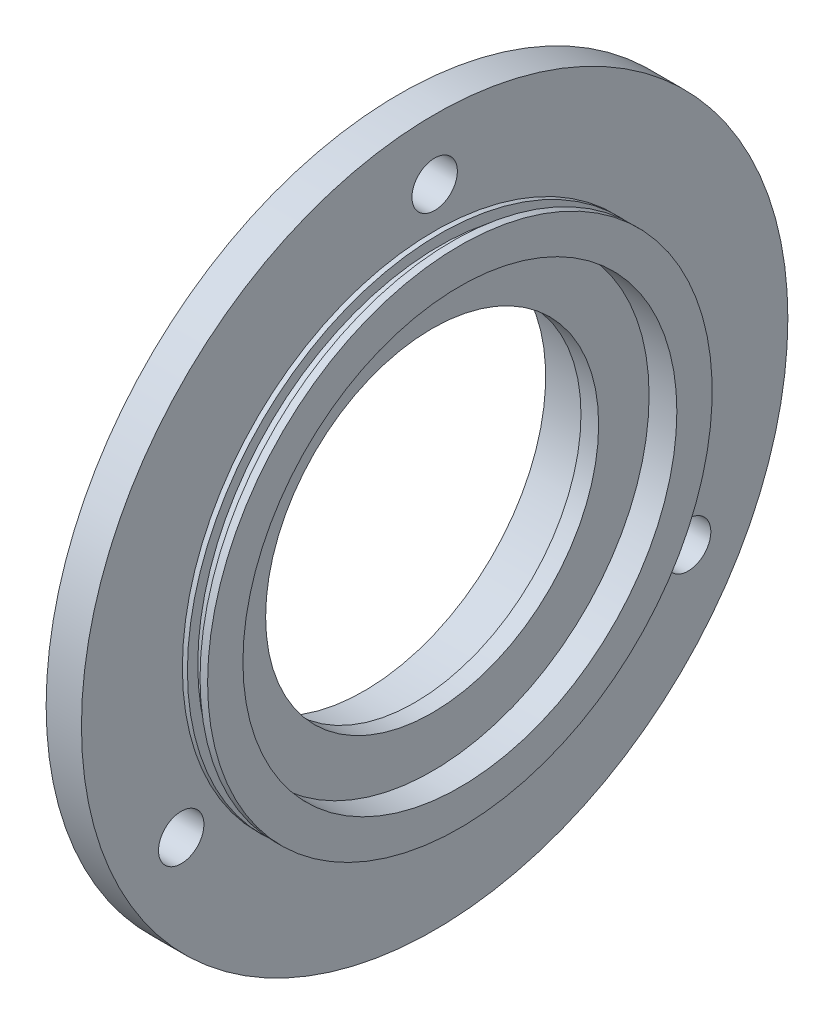
ISO-10303-21;
HEADER;
FILE_DESCRIPTION(('STEP AP214'),'2;1');
FILE_NAME('part.step','',(''),(''),'','','');
FILE_SCHEMA(('AUTOMOTIVE_DESIGN { 1 0 10303 214 1 1 1 1 }'));
ENDSEC;
DATA;
#1=APPLICATION_CONTEXT('core data for automotive mechanical design processes');
#2=APPLICATION_PROTOCOL_DEFINITION('international standard','automotive_design',2000,#1);
#3=PRODUCT_CONTEXT('',#1,'mechanical');
#4=PRODUCT('Part','Part','',(#3));
#5=PRODUCT_RELATED_PRODUCT_CATEGORY('part','',(#4));
#6=PRODUCT_DEFINITION_FORMATION('','',#4);
#7=PRODUCT_DEFINITION_CONTEXT('part definition',#1,'design');
#8=PRODUCT_DEFINITION('design','',#6,#7);
#9=PRODUCT_DEFINITION_SHAPE('','',#8);
#10=(LENGTH_UNIT() NAMED_UNIT(*) SI_UNIT(.MILLI.,.METRE.));
#11=(NAMED_UNIT(*) PLANE_ANGLE_UNIT() SI_UNIT($,.RADIAN.));
#12=(NAMED_UNIT(*) SI_UNIT($,.STERADIAN.) SOLID_ANGLE_UNIT());
#13=UNCERTAINTY_MEASURE_WITH_UNIT(LENGTH_MEASURE(1.E-05),#10,'distance_accuracy_value','');
#14=(GEOMETRIC_REPRESENTATION_CONTEXT(3) GLOBAL_UNCERTAINTY_ASSIGNED_CONTEXT((#13)) GLOBAL_UNIT_ASSIGNED_CONTEXT((#10,
#11,#12)) REPRESENTATION_CONTEXT('',''));
#15=CARTESIAN_POINT('',(0.,0.,0.));
#16=DIRECTION('',(0.,0.,1.));
#17=DIRECTION('',(1.,0.,0.));
#18=AXIS2_PLACEMENT_3D('',#15,#16,#17);
#19=CARTESIAN_POINT('',(-54.5549392406658,0.,0.));
#20=DIRECTION('',(-1.,0.,0.));
#21=DIRECTION('',(0.,0.,1.));
#22=AXIS2_PLACEMENT_3D('',#19,#20,#21);
#23=CYLINDRICAL_SURFACE('',#22,43.);
#24=CARTESIAN_POINT('',(0.,0.,0.));
#25=DIRECTION('',(-1.,0.,0.));
#26=DIRECTION('',(0.,0.,1.));
#27=AXIS2_PLACEMENT_3D('',#24,#25,#26);
#28=CIRCLE('',#27,43.);
#29=CARTESIAN_POINT('',(0.,0.,43.));
#30=VERTEX_POINT('',#29);
#31=EDGE_CURVE('E10',#30,#30,#28,.T.);
#32=ORIENTED_EDGE('',*,*,#31,.F.);
#33=EDGE_LOOP('',(#32));
#34=FACE_BOUND('',#33,.T.);
#35=CARTESIAN_POINT('',(-5.5,0.,0.));
#36=DIRECTION('',(-1.,0.,0.));
#37=DIRECTION('',(0.,0.,1.));
#38=AXIS2_PLACEMENT_3D('',#35,#36,#37);
#39=CIRCLE('',#38,43.);
#40=CARTESIAN_POINT('',(-5.5,0.,43.));
#41=VERTEX_POINT('',#40);
#42=EDGE_CURVE('E104',#41,#41,#39,.T.);
#43=ORIENTED_EDGE('',*,*,#42,.T.);
#44=EDGE_LOOP('',(#43));
#45=FACE_BOUND('',#44,.T.);
#46=ADVANCED_FACE('F37',(#34,#45),#23,.F.);
#47=CARTESIAN_POINT('',(0.,43.,0.));
#48=DIRECTION('',(-1.,0.,0.));
#49=DIRECTION('',(0.,0.,1.));
#50=AXIS2_PLACEMENT_3D('',#47,#48,#49);
#51=PLANE('',#50);
#52=CARTESIAN_POINT('',(0.,0.,0.));
#53=DIRECTION('',(-1.,0.,0.));
#54=DIRECTION('',(0.,0.,1.));
#55=AXIS2_PLACEMENT_3D('',#52,#53,#54);
#56=CIRCLE('',#55,50.);
#57=CARTESIAN_POINT('',(0.,0.,50.));
#58=VERTEX_POINT('',#57);
#59=EDGE_CURVE('E44',#58,#58,#56,.T.);
#60=ORIENTED_EDGE('',*,*,#59,.F.);
#61=EDGE_LOOP('',(#60));
#62=FACE_BOUND('',#61,.T.);
#63=ORIENTED_EDGE('',*,*,#31,.T.);
#64=EDGE_LOOP('',(#63));
#65=FACE_BOUND('',#64,.T.);
#66=ADVANCED_FACE('F188',(#62,#65),#51,.F.);
#67=CARTESIAN_POINT('',(-54.5549392406658,0.,0.));
#68=DIRECTION('',(-1.,0.,0.));
#69=DIRECTION('',(0.,0.,1.));
#70=AXIS2_PLACEMENT_3D('',#67,#68,#69);
#71=CYLINDRICAL_SURFACE('',#70,50.);
#72=CARTESIAN_POINT('',(-1.5,0.,0.));
#73=DIRECTION('',(-1.,0.,0.));
#74=DIRECTION('',(0.,0.,1.));
#75=AXIS2_PLACEMENT_3D('',#72,#73,#74);
#76=CIRCLE('',#75,50.);
#77=CARTESIAN_POINT('',(-1.5,0.,50.));
#78=VERTEX_POINT('',#77);
#79=EDGE_CURVE('E49',#78,#78,#76,.T.);
#80=ORIENTED_EDGE('',*,*,#79,.F.);
#81=EDGE_LOOP('',(#80));
#82=FACE_BOUND('',#81,.T.);
#83=ORIENTED_EDGE('',*,*,#59,.T.);
#84=EDGE_LOOP('',(#83));
#85=FACE_BOUND('',#84,.T.);
#86=ADVANCED_FACE('F183',(#82,#85),#71,.T.);
#87=CARTESIAN_POINT('',(-1.5,47.95,0.));
#88=DIRECTION('',(1.,0.,0.));
#89=DIRECTION('',(0.,0.,-1.));
#90=AXIS2_PLACEMENT_3D('',#87,#88,#89);
#91=PLANE('',#90);
#92=CARTESIAN_POINT('',(-1.5,0.,0.));
#93=DIRECTION('',(-1.,0.,0.));
#94=DIRECTION('',(0.,0.,1.));
#95=AXIS2_PLACEMENT_3D('',#92,#93,#94);
#96=CIRCLE('',#95,47.95);
#97=CARTESIAN_POINT('',(-1.5,0.,47.95));
#98=VERTEX_POINT('',#97);
#99=EDGE_CURVE('E54',#98,#98,#96,.T.);
#100=ORIENTED_EDGE('',*,*,#99,.F.);
#101=EDGE_LOOP('',(#100));
#102=FACE_BOUND('',#101,.T.);
#103=ORIENTED_EDGE('',*,*,#79,.T.);
#104=EDGE_LOOP('',(#103));
#105=FACE_BOUND('',#104,.T.);
#106=ADVANCED_FACE('F177',(#102,#105),#91,.F.);
#107=CARTESIAN_POINT('',(-54.5549392406658,0.,0.));
#108=DIRECTION('',(-1.,0.,0.));
#109=DIRECTION('',(0.,0.,1.));
#110=AXIS2_PLACEMENT_3D('',#107,#108,#109);
#111=CYLINDRICAL_SURFACE('',#110,47.95);
#112=CARTESIAN_POINT('',(-4.,0.,0.));
#113=DIRECTION('',(-1.,0.,0.));
#114=DIRECTION('',(0.,0.,1.));
#115=AXIS2_PLACEMENT_3D('',#112,#113,#114);
#116=CIRCLE('',#115,47.95);
#117=CARTESIAN_POINT('',(-4.,0.,47.95));
#118=VERTEX_POINT('',#117);
#119=EDGE_CURVE('E60',#118,#118,#116,.T.);
#120=ORIENTED_EDGE('',*,*,#119,.F.);
#121=EDGE_LOOP('',(#120));
#122=FACE_BOUND('',#121,.T.);
#123=ORIENTED_EDGE('',*,*,#99,.T.);
#124=EDGE_LOOP('',(#123));
#125=FACE_BOUND('',#124,.T.);
#126=ADVANCED_FACE('F171',(#122,#125),#111,.T.);
#127=CARTESIAN_POINT('',(-4.,50.,0.));
#128=DIRECTION('',(-1.,0.,0.));
#129=DIRECTION('',(0.,0.,1.));
#130=AXIS2_PLACEMENT_3D('',#127,#128,#129);
#131=PLANE('',#130);
#132=CARTESIAN_POINT('',(-4.,0.,0.));
#133=DIRECTION('',(-1.,0.,0.));
#134=DIRECTION('',(0.,0.,1.));
#135=AXIS2_PLACEMENT_3D('',#132,#133,#134);
#136=CIRCLE('',#135,50.);
#137=CARTESIAN_POINT('',(-4.,0.,50.));
#138=VERTEX_POINT('',#137);
#139=EDGE_CURVE('E64',#138,#138,#136,.T.);
#140=ORIENTED_EDGE('',*,*,#139,.F.);
#141=EDGE_LOOP('',(#140));
#142=FACE_BOUND('',#141,.T.);
#143=ORIENTED_EDGE('',*,*,#119,.T.);
#144=EDGE_LOOP('',(#143));
#145=FACE_BOUND('',#144,.T.);
#146=ADVANCED_FACE('F165',(#142,#145),#131,.F.);
#147=CARTESIAN_POINT('',(-54.5549392406658,0.,0.));
#148=DIRECTION('',(-1.,0.,0.));
#149=DIRECTION('',(0.,0.,1.));
#150=AXIS2_PLACEMENT_3D('',#147,#148,#149);
#151=CYLINDRICAL_SURFACE('',#150,50.);
#152=CARTESIAN_POINT('',(-5.,0.,0.));
#153=DIRECTION('',(-1.,0.,0.));
#154=DIRECTION('',(0.,0.,1.));
#155=AXIS2_PLACEMENT_3D('',#152,#153,#154);
#156=CIRCLE('',#155,50.);
#157=CARTESIAN_POINT('',(-5.,0.,50.));
#158=VERTEX_POINT('',#157);
#159=EDGE_CURVE('E68',#158,#158,#156,.T.);
#160=ORIENTED_EDGE('',*,*,#159,.F.);
#161=EDGE_LOOP('',(#160));
#162=FACE_BOUND('',#161,.T.);
#163=ORIENTED_EDGE('',*,*,#139,.T.);
#164=EDGE_LOOP('',(#163));
#165=FACE_BOUND('',#164,.T.);
#166=ADVANCED_FACE('F158',(#162,#165),#151,.T.);
#167=CARTESIAN_POINT('',(-5.,50.,0.));
#168=DIRECTION('',(-1.,0.,0.));
#169=DIRECTION('',(0.,0.,1.));
#170=AXIS2_PLACEMENT_3D('',#167,#168,#169);
#171=PLANE('',#170);
#172=CARTESIAN_POINT('',(-5.,58.,0.));
#173=DIRECTION('',(-1.,0.,0.));
#174=DIRECTION('',(0.,0.,1.));
#175=AXIS2_PLACEMENT_3D('',#172,#173,#174);
#176=CIRCLE('',#175,4.5);
#177=CARTESIAN_POINT('',(-5.,58.,4.5));
#178=VERTEX_POINT('',#177);
#179=EDGE_CURVE('E108',#178,#178,#176,.T.);
#180=ORIENTED_EDGE('',*,*,#179,.T.);
#181=EDGE_LOOP('',(#180));
#182=FACE_BOUND('',#181,.T.);
#183=CARTESIAN_POINT('',(-5.,-28.9999999999982,50.2294734195006));
#184=DIRECTION('',(-1.,0.,0.));
#185=DIRECTION('',(0.,0.,1.));
#186=AXIS2_PLACEMENT_3D('',#183,#184,#185);
#187=CIRCLE('',#186,4.5);
#188=CARTESIAN_POINT('',(-5.,-28.9999999999982,54.7294734195006));
#189=VERTEX_POINT('',#188);
#190=EDGE_CURVE('E112',#189,#189,#187,.T.);
#191=ORIENTED_EDGE('',*,*,#190,.T.);
#192=EDGE_LOOP('',(#191));
#193=FACE_BOUND('',#192,.T.);
#194=CARTESIAN_POINT('',(-5.,-29.0000000000019,-50.2294734194943));
#195=DIRECTION('',(-1.,0.,0.));
#196=DIRECTION('',(0.,0.,1.));
#197=AXIS2_PLACEMENT_3D('',#194,#195,#196);
#198=CIRCLE('',#197,4.5);
#199=CARTESIAN_POINT('',(-5.,-29.0000000000019,-45.7294734194943));
#200=VERTEX_POINT('',#199);
#201=EDGE_CURVE('E116',#200,#200,#198,.T.);
#202=ORIENTED_EDGE('',*,*,#201,.T.);
#203=EDGE_LOOP('',(#202));
#204=FACE_BOUND('',#203,.T.);
#205=CARTESIAN_POINT('',(-5.,0.,0.));
#206=DIRECTION('',(-1.,0.,0.));
#207=DIRECTION('',(0.,0.,1.));
#208=AXIS2_PLACEMENT_3D('',#205,#206,#207);
#209=CIRCLE('',#208,70.);
#210=CARTESIAN_POINT('',(-5.,0.,70.));
#211=VERTEX_POINT('',#210);
#212=EDGE_CURVE('E72',#211,#211,#209,.T.);
#213=ORIENTED_EDGE('',*,*,#212,.F.);
#214=EDGE_LOOP('',(#213));
#215=FACE_BOUND('',#214,.T.);
#216=ORIENTED_EDGE('',*,*,#159,.T.);
#217=EDGE_LOOP('',(#216));
#218=FACE_BOUND('',#217,.T.);
#219=ADVANCED_FACE('F152',(#182,#193,#204,#215,#218),#171,.F.);
#220=CARTESIAN_POINT('',(-54.5549392406658,0.,0.));
#221=DIRECTION('',(-1.,0.,0.));
#222=DIRECTION('',(0.,0.,1.));
#223=AXIS2_PLACEMENT_3D('',#220,#221,#222);
#224=CYLINDRICAL_SURFACE('',#223,70.);
#225=CARTESIAN_POINT('',(-12.,0.,0.));
#226=DIRECTION('',(-1.,0.,0.));
#227=DIRECTION('',(0.,0.,1.));
#228=AXIS2_PLACEMENT_3D('',#225,#226,#227);
#229=CIRCLE('',#228,70.);
#230=CARTESIAN_POINT('',(-12.,0.,70.));
#231=VERTEX_POINT('',#230);
#232=EDGE_CURVE('E76',#231,#231,#229,.T.);
#233=ORIENTED_EDGE('',*,*,#232,.F.);
#234=EDGE_LOOP('',(#233));
#235=FACE_BOUND('',#234,.T.);
#236=ORIENTED_EDGE('',*,*,#212,.T.);
#237=EDGE_LOOP('',(#236));
#238=FACE_BOUND('',#237,.T.);
#239=ADVANCED_FACE('F140',(#235,#238),#224,.T.);
#240=CARTESIAN_POINT('',(-12.,70.,0.));
#241=DIRECTION('',(1.,0.,0.));
#242=DIRECTION('',(0.,0.,-1.));
#243=AXIS2_PLACEMENT_3D('',#240,#241,#242);
#244=PLANE('',#243);
#245=CARTESIAN_POINT('',(-12.,58.,0.));
#246=DIRECTION('',(-1.,0.,0.));
#247=DIRECTION('',(0.,0.,1.));
#248=AXIS2_PLACEMENT_3D('',#245,#246,#247);
#249=CIRCLE('',#248,4.5);
#250=CARTESIAN_POINT('',(-12.,58.,4.5));
#251=VERTEX_POINT('',#250);
#252=EDGE_CURVE('E120',#251,#251,#249,.T.);
#253=ORIENTED_EDGE('',*,*,#252,.F.);
#254=EDGE_LOOP('',(#253));
#255=FACE_BOUND('',#254,.T.);
#256=CARTESIAN_POINT('',(-12.,-28.9999999999982,50.2294734195006));
#257=DIRECTION('',(-1.,0.,0.));
#258=DIRECTION('',(0.,0.,1.));
#259=AXIS2_PLACEMENT_3D('',#256,#257,#258);
#260=CIRCLE('',#259,4.5);
#261=CARTESIAN_POINT('',(-12.,-28.9999999999982,54.7294734195006));
#262=VERTEX_POINT('',#261);
#263=EDGE_CURVE('E125',#262,#262,#260,.T.);
#264=ORIENTED_EDGE('',*,*,#263,.F.);
#265=EDGE_LOOP('',(#264));
#266=FACE_BOUND('',#265,.T.);
#267=CARTESIAN_POINT('',(-12.,-29.0000000000019,-50.2294734194943));
#268=DIRECTION('',(-1.,0.,0.));
#269=DIRECTION('',(0.,0.,1.));
#270=AXIS2_PLACEMENT_3D('',#267,#268,#269);
#271=CIRCLE('',#270,4.5);
#272=CARTESIAN_POINT('',(-12.,-29.0000000000019,-45.7294734194943));
#273=VERTEX_POINT('',#272);
#274=EDGE_CURVE('E121',#273,#273,#271,.T.);
#275=ORIENTED_EDGE('',*,*,#274,.F.);
#276=EDGE_LOOP('',(#275));
#277=FACE_BOUND('',#276,.T.);
#278=CARTESIAN_POINT('',(-12.,0.,0.));
#279=DIRECTION('',(-1.,0.,0.));
#280=DIRECTION('',(0.,0.,1.));
#281=AXIS2_PLACEMENT_3D('',#278,#279,#280);
#282=CIRCLE('',#281,39.);
#283=CARTESIAN_POINT('',(-12.,0.,39.));
#284=VERTEX_POINT('',#283);
#285=EDGE_CURVE('E80',#284,#284,#282,.T.);
#286=ORIENTED_EDGE('',*,*,#285,.F.);
#287=EDGE_LOOP('',(#286));
#288=FACE_BOUND('',#287,.T.);
#289=ORIENTED_EDGE('',*,*,#232,.T.);
#290=EDGE_LOOP('',(#289));
#291=FACE_BOUND('',#290,.T.);
#292=ADVANCED_FACE('F136',(#255,#266,#277,#288,#291),#244,.F.);
#293=CARTESIAN_POINT('',(-54.5549392406658,0.,0.));
#294=DIRECTION('',(-1.,0.,0.));
#295=DIRECTION('',(0.,0.,1.));
#296=AXIS2_PLACEMENT_3D('',#293,#294,#295);
#297=CYLINDRICAL_SURFACE('',#296,39.);
#298=CARTESIAN_POINT('',(-19.,0.,0.));
#299=DIRECTION('',(-1.,0.,0.));
#300=DIRECTION('',(0.,0.,1.));
#301=AXIS2_PLACEMENT_3D('',#298,#299,#300);
#302=CIRCLE('',#301,39.);
#303=CARTESIAN_POINT('',(-19.,0.,39.));
#304=VERTEX_POINT('',#303);
#305=EDGE_CURVE('E84',#304,#304,#302,.T.);
#306=ORIENTED_EDGE('',*,*,#305,.F.);
#307=EDGE_LOOP('',(#306));
#308=FACE_BOUND('',#307,.T.);
#309=ORIENTED_EDGE('',*,*,#285,.T.);
#310=EDGE_LOOP('',(#309));
#311=FACE_BOUND('',#310,.T.);
#312=ADVANCED_FACE('F139',(#308,#311),#297,.T.);
#313=CARTESIAN_POINT('',(-19.,39.,0.));
#314=DIRECTION('',(1.,0.,0.));
#315=DIRECTION('',(0.,0.,-1.));
#316=AXIS2_PLACEMENT_3D('',#313,#314,#315);
#317=PLANE('',#316);
#318=CARTESIAN_POINT('',(-19.,0.,0.));
#319=DIRECTION('',(-1.,0.,0.));
#320=DIRECTION('',(0.,0.,1.));
#321=AXIS2_PLACEMENT_3D('',#318,#319,#320);
#322=CIRCLE('',#321,36.);
#323=CARTESIAN_POINT('',(-19.,0.,36.));
#324=VERTEX_POINT('',#323);
#325=EDGE_CURVE('E88',#324,#324,#322,.T.);
#326=ORIENTED_EDGE('',*,*,#325,.F.);
#327=EDGE_LOOP('',(#326));
#328=FACE_BOUND('',#327,.T.);
#329=ORIENTED_EDGE('',*,*,#305,.T.);
#330=EDGE_LOOP('',(#329));
#331=FACE_BOUND('',#330,.T.);
#332=ADVANCED_FACE('F223',(#328,#331),#317,.F.);
#333=CARTESIAN_POINT('',(-54.5549392406658,0.,0.));
#334=DIRECTION('',(-1.,0.,0.));
#335=DIRECTION('',(0.,0.,1.));
#336=AXIS2_PLACEMENT_3D('',#333,#334,#335);
#337=CYLINDRICAL_SURFACE('',#336,36.);
#338=CARTESIAN_POINT('',(-9.,0.,0.));
#339=DIRECTION('',(-1.,0.,0.));
#340=DIRECTION('',(0.,0.,1.));
#341=AXIS2_PLACEMENT_3D('',#338,#339,#340);
#342=CIRCLE('',#341,36.);
#343=CARTESIAN_POINT('',(-9.,0.,36.));
#344=VERTEX_POINT('',#343);
#345=EDGE_CURVE('E92',#344,#344,#342,.T.);
#346=ORIENTED_EDGE('',*,*,#345,.F.);
#347=EDGE_LOOP('',(#346));
#348=FACE_BOUND('',#347,.T.);
#349=ORIENTED_EDGE('',*,*,#325,.T.);
#350=EDGE_LOOP('',(#349));
#351=FACE_BOUND('',#350,.T.);
#352=ADVANCED_FACE('F217',(#348,#351),#337,.F.);
#353=CARTESIAN_POINT('',(-9.,36.,0.));
#354=DIRECTION('',(1.,0.,0.));
#355=DIRECTION('',(0.,0.,-1.));
#356=AXIS2_PLACEMENT_3D('',#353,#354,#355);
#357=PLANE('',#356);
#358=CARTESIAN_POINT('',(-9.,0.,0.));
#359=DIRECTION('',(-1.,0.,0.));
#360=DIRECTION('',(0.,0.,1.));
#361=AXIS2_PLACEMENT_3D('',#358,#359,#360);
#362=CIRCLE('',#361,33.);
#363=CARTESIAN_POINT('',(-9.,0.,33.));
#364=VERTEX_POINT('',#363);
#365=EDGE_CURVE('E96',#364,#364,#362,.T.);
#366=ORIENTED_EDGE('',*,*,#365,.F.);
#367=EDGE_LOOP('',(#366));
#368=FACE_BOUND('',#367,.T.);
#369=ORIENTED_EDGE('',*,*,#345,.T.);
#370=EDGE_LOOP('',(#369));
#371=FACE_BOUND('',#370,.T.);
#372=ADVANCED_FACE('F211',(#368,#371),#357,.F.);
#373=CARTESIAN_POINT('',(-54.5549392406658,0.,0.));
#374=DIRECTION('',(-1.,0.,0.));
#375=DIRECTION('',(0.,0.,1.));
#376=AXIS2_PLACEMENT_3D('',#373,#374,#375);
#377=CYLINDRICAL_SURFACE('',#376,33.);
#378=CARTESIAN_POINT('',(-5.5,0.,0.));
#379=DIRECTION('',(-1.,0.,0.));
#380=DIRECTION('',(0.,0.,1.));
#381=AXIS2_PLACEMENT_3D('',#378,#379,#380);
#382=CIRCLE('',#381,33.);
#383=CARTESIAN_POINT('',(-5.5,0.,33.));
#384=VERTEX_POINT('',#383);
#385=EDGE_CURVE('E100',#384,#384,#382,.T.);
#386=ORIENTED_EDGE('',*,*,#385,.F.);
#387=EDGE_LOOP('',(#386));
#388=FACE_BOUND('',#387,.T.);
#389=ORIENTED_EDGE('',*,*,#365,.T.);
#390=EDGE_LOOP('',(#389));
#391=FACE_BOUND('',#390,.T.);
#392=ADVANCED_FACE('F205',(#388,#391),#377,.F.);
#393=CARTESIAN_POINT('',(-5.5,33.,0.));
#394=DIRECTION('',(-1.,0.,0.));
#395=DIRECTION('',(0.,0.,1.));
#396=AXIS2_PLACEMENT_3D('',#393,#394,#395);
#397=PLANE('',#396);
#398=ORIENTED_EDGE('',*,*,#42,.F.);
#399=EDGE_LOOP('',(#398));
#400=FACE_BOUND('',#399,.T.);
#401=ORIENTED_EDGE('',*,*,#385,.T.);
#402=EDGE_LOOP('',(#401));
#403=FACE_BOUND('',#402,.T.);
#404=ADVANCED_FACE('F201',(#400,#403),#397,.F.);
#405=CARTESIAN_POINT('',(45.,-29.0000000000019,-50.2294734194943));
#406=DIRECTION('',(-1.,0.,0.));
#407=DIRECTION('',(0.,0.,1.));
#408=AXIS2_PLACEMENT_3D('',#405,#406,#407);
#409=CYLINDRICAL_SURFACE('',#408,4.5);
#410=CARTESIAN_POINT('',(-12.,-29.0000000000019,-45.7294734194943));
#411=CARTESIAN_POINT('',(-11.9270833333333,-29.0000000000019,-45.7294734194943));
#412=CARTESIAN_POINT('',(-11.8541666666667,-29.0000000000019,-45.7294734194943));
#413=CARTESIAN_POINT('',(-11.7083333333333,-29.0000000000019,-45.7294734194943));
#414=CARTESIAN_POINT('',(-11.6354166666667,-29.0000000000019,-45.7294734194943));
#415=CARTESIAN_POINT('',(-11.4895833333333,-29.0000000000019,-45.7294734194943));
#416=CARTESIAN_POINT('',(-11.4166666666667,-29.0000000000019,-45.7294734194943));
#417=CARTESIAN_POINT('',(-11.2708333333333,-29.0000000000019,-45.7294734194943));
#418=CARTESIAN_POINT('',(-11.1979166666667,-29.0000000000019,-45.7294734194943));
#419=CARTESIAN_POINT('',(-11.0520833333333,-29.0000000000019,-45.7294734194943));
#420=CARTESIAN_POINT('',(-10.9791666666667,-29.0000000000019,-45.7294734194943));
#421=CARTESIAN_POINT('',(-10.8333333333333,-29.0000000000019,-45.7294734194943));
#422=CARTESIAN_POINT('',(-10.7604166666667,-29.0000000000019,-45.7294734194943));
#423=CARTESIAN_POINT('',(-10.6145833333333,-29.0000000000019,-45.7294734194943));
#424=CARTESIAN_POINT('',(-10.5416666666667,-29.0000000000019,-45.7294734194943));
#425=CARTESIAN_POINT('',(-10.3958333333333,-29.0000000000019,-45.7294734194943));
#426=CARTESIAN_POINT('',(-10.3229166666667,-29.0000000000019,-45.7294734194943));
#427=CARTESIAN_POINT('',(-10.1770833333333,-29.0000000000019,-45.7294734194943));
#428=CARTESIAN_POINT('',(-10.1041666666667,-29.0000000000019,-45.7294734194943));
#429=CARTESIAN_POINT('',(-9.95833333333333,-29.0000000000019,-45.7294734194943));
#430=CARTESIAN_POINT('',(-9.88541666666667,-29.0000000000019,-45.7294734194943));
#431=CARTESIAN_POINT('',(-9.73958333333334,-29.0000000000019,-45.7294734194943));
#432=CARTESIAN_POINT('',(-9.66666666666667,-29.0000000000019,-45.7294734194943));
#433=CARTESIAN_POINT('',(-9.52083333333334,-29.0000000000019,-45.7294734194943));
#434=CARTESIAN_POINT('',(-9.44791666666667,-29.0000000000019,-45.7294734194943));
#435=CARTESIAN_POINT('',(-9.30208333333333,-29.0000000000019,-45.7294734194943));
#436=CARTESIAN_POINT('',(-9.22916666666666,-29.0000000000019,-45.7294734194943));
#437=CARTESIAN_POINT('',(-9.08333333333333,-29.0000000000019,-45.7294734194943));
#438=CARTESIAN_POINT('',(-9.01041666666667,-29.0000000000019,-45.7294734194943));
#439=CARTESIAN_POINT('',(-8.86458333333334,-29.0000000000019,-45.7294734194943));
#440=CARTESIAN_POINT('',(-8.79166666666667,-29.0000000000019,-45.7294734194943));
#441=CARTESIAN_POINT('',(-8.64583333333334,-29.0000000000019,-45.7294734194943));
#442=CARTESIAN_POINT('',(-8.57291666666667,-29.0000000000019,-45.7294734194943));
#443=CARTESIAN_POINT('',(-8.42708333333333,-29.0000000000019,-45.7294734194943));
#444=CARTESIAN_POINT('',(-8.35416666666666,-29.0000000000019,-45.7294734194943));
#445=CARTESIAN_POINT('',(-8.20833333333333,-29.0000000000019,-45.7294734194943));
#446=CARTESIAN_POINT('',(-8.13541666666667,-29.0000000000019,-45.7294734194943));
#447=CARTESIAN_POINT('',(-7.98958333333333,-29.0000000000019,-45.7294734194943));
#448=CARTESIAN_POINT('',(-7.91666666666667,-29.0000000000019,-45.7294734194943));
#449=CARTESIAN_POINT('',(-7.77083333333334,-29.0000000000019,-45.7294734194943));
#450=CARTESIAN_POINT('',(-7.69791666666667,-29.0000000000019,-45.7294734194943));
#451=CARTESIAN_POINT('',(-7.55208333333333,-29.0000000000019,-45.7294734194943));
#452=CARTESIAN_POINT('',(-7.47916666666666,-29.0000000000019,-45.7294734194943));
#453=CARTESIAN_POINT('',(-7.33333333333333,-29.0000000000019,-45.7294734194943));
#454=CARTESIAN_POINT('',(-7.26041666666667,-29.0000000000019,-45.7294734194943));
#455=CARTESIAN_POINT('',(-7.11458333333333,-29.0000000000019,-45.7294734194943));
#456=CARTESIAN_POINT('',(-7.04166666666667,-29.0000000000019,-45.7294734194943));
#457=CARTESIAN_POINT('',(-6.89583333333333,-29.0000000000019,-45.7294734194943));
#458=CARTESIAN_POINT('',(-6.82291666666667,-29.0000000000019,-45.7294734194943));
#459=CARTESIAN_POINT('',(-6.67708333333333,-29.0000000000019,-45.7294734194943));
#460=CARTESIAN_POINT('',(-6.60416666666666,-29.0000000000019,-45.7294734194943));
#461=CARTESIAN_POINT('',(-6.45833333333333,-29.0000000000019,-45.7294734194943));
#462=CARTESIAN_POINT('',(-6.38541666666666,-29.0000000000019,-45.7294734194943));
#463=CARTESIAN_POINT('',(-6.23958333333333,-29.0000000000019,-45.7294734194943));
#464=CARTESIAN_POINT('',(-6.16666666666667,-29.0000000000019,-45.7294734194943));
#465=CARTESIAN_POINT('',(-6.02083333333333,-29.0000000000019,-45.7294734194943));
#466=CARTESIAN_POINT('',(-5.94791666666667,-29.0000000000019,-45.7294734194943));
#467=CARTESIAN_POINT('',(-5.80208333333333,-29.0000000000019,-45.7294734194943));
#468=CARTESIAN_POINT('',(-5.72916666666666,-29.0000000000019,-45.7294734194943));
#469=CARTESIAN_POINT('',(-5.58333333333333,-29.0000000000019,-45.7294734194943));
#470=CARTESIAN_POINT('',(-5.51041666666666,-29.0000000000019,-45.7294734194943));
#471=CARTESIAN_POINT('',(-5.36458333333333,-29.0000000000019,-45.7294734194943));
#472=CARTESIAN_POINT('',(-5.29166666666667,-29.0000000000019,-45.7294734194943));
#473=CARTESIAN_POINT('',(-5.14583333333333,-29.0000000000019,-45.7294734194943));
#474=CARTESIAN_POINT('',(-5.07291666666667,-29.0000000000019,-45.7294734194943));
#475=CARTESIAN_POINT('',(-5.,-29.0000000000019,-45.7294734194943));
#476=B_SPLINE_CURVE_WITH_KNOTS('',3,(#410,#411,#412,#413,#414,#415,#416,#417,#418,#419,#420,
#421,#422,#423,#424,#425,#426,#427,#428,#429,#430,#431,#432,#433,#434,#435,#436,#437,#438,#439,
#440,#441,#442,#443,#444,#445,#446,#447,#448,#449,#450,#451,#452,#453,#454,#455,#456,#457,#458,
#459,#460,#461,#462,#463,#464,#465,#466,#467,#468,#469,#470,#471,#472,#473,#474,#475),
.UNSPECIFIED.,.F.,.F.,(4,2,2,2,2,2,2,2,2,2,2,2,2,2,2,2,2,2,2,2,2,2,2,2,2,2,2,2,2,2,2,2,4),(0.,
0.218750000000004,0.4375,0.656249999999997,0.875000000000001,1.09375,1.3125,1.53125,1.75,
1.96875000000001,2.1875,2.40625,2.625,2.84375000000001,3.0625,3.28125,3.5,3.71875000000001,
3.9375,4.15625,4.375,4.59375000000001,4.8125,5.03125,5.25,5.46875000000001,5.68750000000001,
5.90625,6.12500000000001,6.34375000000001,6.56250000000001,6.78125,7.00000000000001),.UNSPECIFIED.);
#477=EDGE_CURVE('BSEAM204',#273,#200,#476,.T.);
#478=ORIENTED_EDGE('',*,*,#274,.T.);
#479=ORIENTED_EDGE('',*,*,#201,.F.);
#480=ORIENTED_EDGE('',*,*,#477,.T.);
#481=ORIENTED_EDGE('',*,*,#477,.F.);
#482=EDGE_LOOP('',(#478,#480,#479,#481));
#483=FACE_BOUND('',#482,.T.);
#484=ADVANCED_FACE('F204',(#483),#409,.F.);
#485=CARTESIAN_POINT('',(45.,-28.9999999999982,50.2294734195006));
#486=DIRECTION('',(-1.,0.,0.));
#487=DIRECTION('',(0.,0.,1.));
#488=AXIS2_PLACEMENT_3D('',#485,#486,#487);
#489=CYLINDRICAL_SURFACE('',#488,4.5);
#490=CARTESIAN_POINT('',(-12.,-28.9999999999982,54.7294734195006));
#491=CARTESIAN_POINT('',(-11.9270833333333,-28.9999999999982,54.7294734195006));
#492=CARTESIAN_POINT('',(-11.8541666666667,-28.9999999999982,54.7294734195006));
#493=CARTESIAN_POINT('',(-11.7083333333333,-28.9999999999982,54.7294734195006));
#494=CARTESIAN_POINT('',(-11.6354166666667,-28.9999999999982,54.7294734195006));
#495=CARTESIAN_POINT('',(-11.4895833333333,-28.9999999999982,54.7294734195006));
#496=CARTESIAN_POINT('',(-11.4166666666667,-28.9999999999982,54.7294734195006));
#497=CARTESIAN_POINT('',(-11.2708333333333,-28.9999999999982,54.7294734195006));
#498=CARTESIAN_POINT('',(-11.1979166666667,-28.9999999999982,54.7294734195006));
#499=CARTESIAN_POINT('',(-11.0520833333333,-28.9999999999982,54.7294734195006));
#500=CARTESIAN_POINT('',(-10.9791666666667,-28.9999999999982,54.7294734195006));
#501=CARTESIAN_POINT('',(-10.8333333333333,-28.9999999999982,54.7294734195006));
#502=CARTESIAN_POINT('',(-10.7604166666667,-28.9999999999982,54.7294734195006));
#503=CARTESIAN_POINT('',(-10.6145833333333,-28.9999999999982,54.7294734195006));
#504=CARTESIAN_POINT('',(-10.5416666666667,-28.9999999999982,54.7294734195006));
#505=CARTESIAN_POINT('',(-10.3958333333333,-28.9999999999982,54.7294734195006));
#506=CARTESIAN_POINT('',(-10.3229166666667,-28.9999999999982,54.7294734195006));
#507=CARTESIAN_POINT('',(-10.1770833333333,-28.9999999999982,54.7294734195006));
#508=CARTESIAN_POINT('',(-10.1041666666667,-28.9999999999982,54.7294734195006));
#509=CARTESIAN_POINT('',(-9.95833333333333,-28.9999999999982,54.7294734195006));
#510=CARTESIAN_POINT('',(-9.88541666666667,-28.9999999999982,54.7294734195006));
#511=CARTESIAN_POINT('',(-9.73958333333334,-28.9999999999982,54.7294734195006));
#512=CARTESIAN_POINT('',(-9.66666666666667,-28.9999999999982,54.7294734195006));
#513=CARTESIAN_POINT('',(-9.52083333333334,-28.9999999999982,54.7294734195006));
#514=CARTESIAN_POINT('',(-9.44791666666667,-28.9999999999982,54.7294734195006));
#515=CARTESIAN_POINT('',(-9.30208333333333,-28.9999999999982,54.7294734195006));
#516=CARTESIAN_POINT('',(-9.22916666666666,-28.9999999999982,54.7294734195006));
#517=CARTESIAN_POINT('',(-9.08333333333333,-28.9999999999982,54.7294734195006));
#518=CARTESIAN_POINT('',(-9.01041666666667,-28.9999999999982,54.7294734195006));
#519=CARTESIAN_POINT('',(-8.86458333333334,-28.9999999999982,54.7294734195006));
#520=CARTESIAN_POINT('',(-8.79166666666667,-28.9999999999982,54.7294734195006));
#521=CARTESIAN_POINT('',(-8.64583333333334,-28.9999999999982,54.7294734195006));
#522=CARTESIAN_POINT('',(-8.57291666666667,-28.9999999999982,54.7294734195006));
#523=CARTESIAN_POINT('',(-8.42708333333333,-28.9999999999982,54.7294734195006));
#524=CARTESIAN_POINT('',(-8.35416666666666,-28.9999999999982,54.7294734195006));
#525=CARTESIAN_POINT('',(-8.20833333333333,-28.9999999999982,54.7294734195006));
#526=CARTESIAN_POINT('',(-8.13541666666667,-28.9999999999982,54.7294734195006));
#527=CARTESIAN_POINT('',(-7.98958333333333,-28.9999999999982,54.7294734195006));
#528=CARTESIAN_POINT('',(-7.91666666666667,-28.9999999999982,54.7294734195006));
#529=CARTESIAN_POINT('',(-7.77083333333334,-28.9999999999982,54.7294734195006));
#530=CARTESIAN_POINT('',(-7.69791666666667,-28.9999999999982,54.7294734195006));
#531=CARTESIAN_POINT('',(-7.55208333333333,-28.9999999999982,54.7294734195006));
#532=CARTESIAN_POINT('',(-7.47916666666666,-28.9999999999982,54.7294734195006));
#533=CARTESIAN_POINT('',(-7.33333333333333,-28.9999999999982,54.7294734195006));
#534=CARTESIAN_POINT('',(-7.26041666666667,-28.9999999999982,54.7294734195006));
#535=CARTESIAN_POINT('',(-7.11458333333333,-28.9999999999982,54.7294734195006));
#536=CARTESIAN_POINT('',(-7.04166666666667,-28.9999999999982,54.7294734195006));
#537=CARTESIAN_POINT('',(-6.89583333333333,-28.9999999999982,54.7294734195006));
#538=CARTESIAN_POINT('',(-6.82291666666667,-28.9999999999982,54.7294734195006));
#539=CARTESIAN_POINT('',(-6.67708333333333,-28.9999999999982,54.7294734195006));
#540=CARTESIAN_POINT('',(-6.60416666666666,-28.9999999999982,54.7294734195006));
#541=CARTESIAN_POINT('',(-6.45833333333333,-28.9999999999982,54.7294734195006));
#542=CARTESIAN_POINT('',(-6.38541666666666,-28.9999999999982,54.7294734195006));
#543=CARTESIAN_POINT('',(-6.23958333333333,-28.9999999999982,54.7294734195006));
#544=CARTESIAN_POINT('',(-6.16666666666667,-28.9999999999982,54.7294734195006));
#545=CARTESIAN_POINT('',(-6.02083333333333,-28.9999999999982,54.7294734195006));
#546=CARTESIAN_POINT('',(-5.94791666666667,-28.9999999999982,54.7294734195006));
#547=CARTESIAN_POINT('',(-5.80208333333333,-28.9999999999982,54.7294734195006));
#548=CARTESIAN_POINT('',(-5.72916666666666,-28.9999999999982,54.7294734195006));
#549=CARTESIAN_POINT('',(-5.58333333333333,-28.9999999999982,54.7294734195006));
#550=CARTESIAN_POINT('',(-5.51041666666666,-28.9999999999982,54.7294734195006));
#551=CARTESIAN_POINT('',(-5.36458333333333,-28.9999999999982,54.7294734195006));
#552=CARTESIAN_POINT('',(-5.29166666666667,-28.9999999999982,54.7294734195006));
#553=CARTESIAN_POINT('',(-5.14583333333333,-28.9999999999982,54.7294734195006));
#554=CARTESIAN_POINT('',(-5.07291666666667,-28.9999999999982,54.7294734195006));
#555=CARTESIAN_POINT('',(-5.,-28.9999999999982,54.7294734195006));
#556=B_SPLINE_CURVE_WITH_KNOTS('',3,(#490,#491,#492,#493,#494,#495,#496,#497,#498,#499,#500,
#501,#502,#503,#504,#505,#506,#507,#508,#509,#510,#511,#512,#513,#514,#515,#516,#517,#518,#519,
#520,#521,#522,#523,#524,#525,#526,#527,#528,#529,#530,#531,#532,#533,#534,#535,#536,#537,#538,
#539,#540,#541,#542,#543,#544,#545,#546,#547,#548,#549,#550,#551,#552,#553,#554,#555),
.UNSPECIFIED.,.F.,.F.,(4,2,2,2,2,2,2,2,2,2,2,2,2,2,2,2,2,2,2,2,2,2,2,2,2,2,2,2,2,2,2,2,4),(0.,
0.218750000000004,0.4375,0.656249999999997,0.875000000000001,1.09375,1.3125,1.53125,1.75,
1.96875000000001,2.1875,2.40625,2.625,2.84375000000001,3.0625,3.28125,3.5,3.71875000000001,
3.9375,4.15625,4.375,4.59375000000001,4.8125,5.03125,5.25,5.46875000000001,5.68750000000001,
5.90625,6.12500000000001,6.34375000000001,6.56250000000001,6.78125,7.00000000000001),.UNSPECIFIED.);
#557=EDGE_CURVE('BSEAM240',#262,#189,#556,.T.);
#558=ORIENTED_EDGE('',*,*,#263,.T.);
#559=ORIENTED_EDGE('',*,*,#190,.F.);
#560=ORIENTED_EDGE('',*,*,#557,.T.);
#561=ORIENTED_EDGE('',*,*,#557,.F.);
#562=EDGE_LOOP('',(#558,#560,#559,#561));
#563=FACE_BOUND('',#562,.T.);
#564=ADVANCED_FACE('F240',(#563),#489,.F.);
#565=CARTESIAN_POINT('',(45.,58.,0.));
#566=DIRECTION('',(-1.,0.,0.));
#567=DIRECTION('',(0.,0.,1.));
#568=AXIS2_PLACEMENT_3D('',#565,#566,#567);
#569=CYLINDRICAL_SURFACE('',#568,4.5);
#570=CARTESIAN_POINT('',(-12.,58.,4.5));
#571=CARTESIAN_POINT('',(-11.9270833333333,58.,4.5));
#572=CARTESIAN_POINT('',(-11.8541666666667,58.,4.5));
#573=CARTESIAN_POINT('',(-11.7083333333333,58.,4.5));
#574=CARTESIAN_POINT('',(-11.6354166666667,58.,4.5));
#575=CARTESIAN_POINT('',(-11.4895833333333,58.,4.5));
#576=CARTESIAN_POINT('',(-11.4166666666667,58.,4.5));
#577=CARTESIAN_POINT('',(-11.2708333333333,58.,4.5));
#578=CARTESIAN_POINT('',(-11.1979166666667,58.,4.5));
#579=CARTESIAN_POINT('',(-11.0520833333333,58.,4.5));
#580=CARTESIAN_POINT('',(-10.9791666666667,58.,4.5));
#581=CARTESIAN_POINT('',(-10.8333333333333,58.,4.5));
#582=CARTESIAN_POINT('',(-10.7604166666667,58.,4.5));
#583=CARTESIAN_POINT('',(-10.6145833333333,58.,4.5));
#584=CARTESIAN_POINT('',(-10.5416666666667,58.,4.5));
#585=CARTESIAN_POINT('',(-10.3958333333333,58.,4.5));
#586=CARTESIAN_POINT('',(-10.3229166666667,58.,4.5));
#587=CARTESIAN_POINT('',(-10.1770833333333,58.,4.5));
#588=CARTESIAN_POINT('',(-10.1041666666667,58.,4.5));
#589=CARTESIAN_POINT('',(-9.95833333333333,58.,4.5));
#590=CARTESIAN_POINT('',(-9.88541666666667,58.,4.5));
#591=CARTESIAN_POINT('',(-9.73958333333334,58.,4.5));
#592=CARTESIAN_POINT('',(-9.66666666666667,58.,4.5));
#593=CARTESIAN_POINT('',(-9.52083333333334,58.,4.5));
#594=CARTESIAN_POINT('',(-9.44791666666667,58.,4.5));
#595=CARTESIAN_POINT('',(-9.30208333333333,58.,4.5));
#596=CARTESIAN_POINT('',(-9.22916666666666,58.,4.5));
#597=CARTESIAN_POINT('',(-9.08333333333333,58.,4.5));
#598=CARTESIAN_POINT('',(-9.01041666666667,58.,4.5));
#599=CARTESIAN_POINT('',(-8.86458333333334,58.,4.5));
#600=CARTESIAN_POINT('',(-8.79166666666667,58.,4.5));
#601=CARTESIAN_POINT('',(-8.64583333333334,58.,4.5));
#602=CARTESIAN_POINT('',(-8.57291666666667,58.,4.5));
#603=CARTESIAN_POINT('',(-8.42708333333333,58.,4.5));
#604=CARTESIAN_POINT('',(-8.35416666666666,58.,4.5));
#605=CARTESIAN_POINT('',(-8.20833333333333,58.,4.5));
#606=CARTESIAN_POINT('',(-8.13541666666667,58.,4.5));
#607=CARTESIAN_POINT('',(-7.98958333333333,58.,4.5));
#608=CARTESIAN_POINT('',(-7.91666666666667,58.,4.5));
#609=CARTESIAN_POINT('',(-7.77083333333334,58.,4.5));
#610=CARTESIAN_POINT('',(-7.69791666666667,58.,4.5));
#611=CARTESIAN_POINT('',(-7.55208333333333,58.,4.5));
#612=CARTESIAN_POINT('',(-7.47916666666666,58.,4.5));
#613=CARTESIAN_POINT('',(-7.33333333333333,58.,4.5));
#614=CARTESIAN_POINT('',(-7.26041666666667,58.,4.5));
#615=CARTESIAN_POINT('',(-7.11458333333333,58.,4.5));
#616=CARTESIAN_POINT('',(-7.04166666666667,58.,4.5));
#617=CARTESIAN_POINT('',(-6.89583333333333,58.,4.5));
#618=CARTESIAN_POINT('',(-6.82291666666667,58.,4.5));
#619=CARTESIAN_POINT('',(-6.67708333333333,58.,4.5));
#620=CARTESIAN_POINT('',(-6.60416666666666,58.,4.5));
#621=CARTESIAN_POINT('',(-6.45833333333333,58.,4.5));
#622=CARTESIAN_POINT('',(-6.38541666666666,58.,4.5));
#623=CARTESIAN_POINT('',(-6.23958333333333,58.,4.5));
#624=CARTESIAN_POINT('',(-6.16666666666667,58.,4.5));
#625=CARTESIAN_POINT('',(-6.02083333333333,58.,4.5));
#626=CARTESIAN_POINT('',(-5.94791666666667,58.,4.5));
#627=CARTESIAN_POINT('',(-5.80208333333333,58.,4.5));
#628=CARTESIAN_POINT('',(-5.72916666666666,58.,4.5));
#629=CARTESIAN_POINT('',(-5.58333333333333,58.,4.5));
#630=CARTESIAN_POINT('',(-5.51041666666666,58.,4.5));
#631=CARTESIAN_POINT('',(-5.36458333333333,58.,4.5));
#632=CARTESIAN_POINT('',(-5.29166666666667,58.,4.5));
#633=CARTESIAN_POINT('',(-5.14583333333333,58.,4.5));
#634=CARTESIAN_POINT('',(-5.07291666666667,58.,4.5));
#635=CARTESIAN_POINT('',(-5.,58.,4.5));
#636=B_SPLINE_CURVE_WITH_KNOTS('',3,(#570,#571,#572,#573,#574,#575,#576,#577,#578,#579,#580,
#581,#582,#583,#584,#585,#586,#587,#588,#589,#590,#591,#592,#593,#594,#595,#596,#597,#598,#599,
#600,#601,#602,#603,#604,#605,#606,#607,#608,#609,#610,#611,#612,#613,#614,#615,#616,#617,#618,
#619,#620,#621,#622,#623,#624,#625,#626,#627,#628,#629,#630,#631,#632,#633,#634,#635),
.UNSPECIFIED.,.F.,.F.,(4,2,2,2,2,2,2,2,2,2,2,2,2,2,2,2,2,2,2,2,2,2,2,2,2,2,2,2,2,2,2,2,4),(0.,
0.218750000000004,0.4375,0.656249999999997,0.875000000000001,1.09375,1.3125,1.53125,1.75,
1.96875000000001,2.1875,2.40625,2.625,2.84375000000001,3.0625,3.28125,3.5,3.71875000000001,
3.9375,4.15625,4.375,4.59375000000001,4.8125,5.03125,5.25,5.46875000000001,5.68750000000001,
5.90625,6.12500000000001,6.34375000000001,6.56250000000001,6.78125,7.00000000000001),.UNSPECIFIED.);
#637=EDGE_CURVE('BSEAM133',#251,#178,#636,.T.);
#638=ORIENTED_EDGE('',*,*,#252,.T.);
#639=ORIENTED_EDGE('',*,*,#179,.F.);
#640=ORIENTED_EDGE('',*,*,#637,.T.);
#641=ORIENTED_EDGE('',*,*,#637,.F.);
#642=EDGE_LOOP('',(#638,#640,#639,#641));
#643=FACE_BOUND('',#642,.T.);
#644=ADVANCED_FACE('F133',(#643),#569,.F.);
#645=CLOSED_SHELL('',(#46,#66,#86,#106,#126,#146,#166,#219,#239,#292,#312,#332,#352,#372,#392,
#404,#484,#564,#644));
#646=MANIFOLD_SOLID_BREP('B2',#645);
#647=ADVANCED_BREP_SHAPE_REPRESENTATION('',(#18,#646),#14);
#648=SHAPE_DEFINITION_REPRESENTATION(#9,#647);
ENDSEC;
END-ISO-10303-21;
